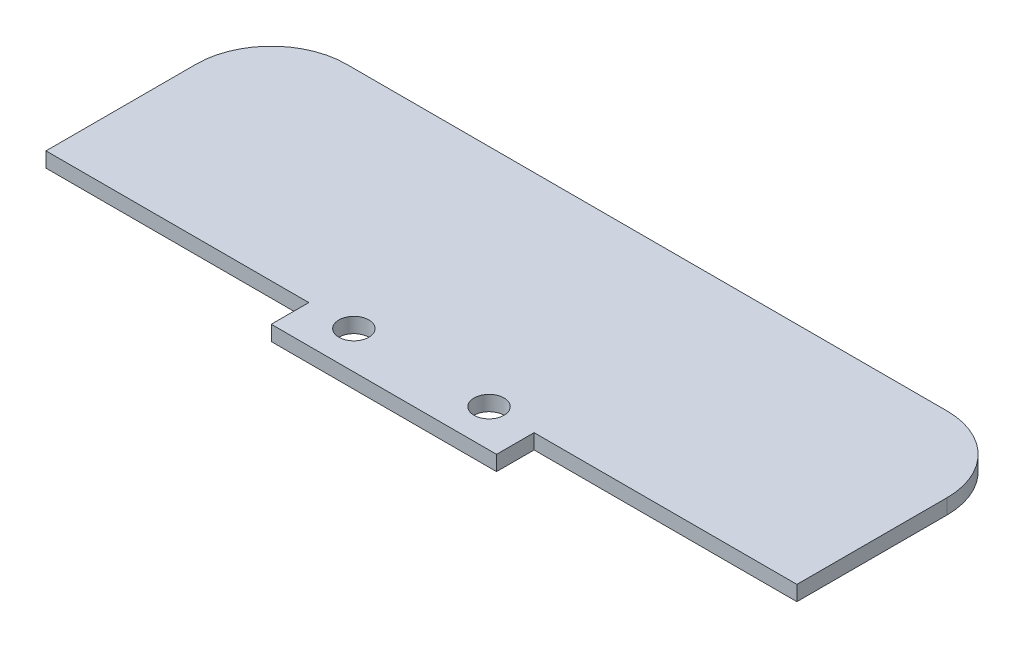
ISO-10303-21;
HEADER;
FILE_DESCRIPTION(('STEP AP214'),'2;1');
FILE_NAME('part.step','',(''),(''),'','','');
FILE_SCHEMA(('AUTOMOTIVE_DESIGN { 1 0 10303 214 1 1 1 1 }'));
ENDSEC;
DATA;
#1=APPLICATION_CONTEXT('core data for automotive mechanical design processes');
#2=APPLICATION_PROTOCOL_DEFINITION('international standard','automotive_design',2000,#1);
#3=PRODUCT_CONTEXT('',#1,'mechanical');
#4=PRODUCT('Part','Part','',(#3));
#5=PRODUCT_RELATED_PRODUCT_CATEGORY('part','',(#4));
#6=PRODUCT_DEFINITION_FORMATION('','',#4);
#7=PRODUCT_DEFINITION_CONTEXT('part definition',#1,'design');
#8=PRODUCT_DEFINITION('design','',#6,#7);
#9=PRODUCT_DEFINITION_SHAPE('','',#8);
#10=(LENGTH_UNIT() NAMED_UNIT(*) SI_UNIT(.MILLI.,.METRE.));
#11=(NAMED_UNIT(*) PLANE_ANGLE_UNIT() SI_UNIT($,.RADIAN.));
#12=(NAMED_UNIT(*) SI_UNIT($,.STERADIAN.) SOLID_ANGLE_UNIT());
#13=UNCERTAINTY_MEASURE_WITH_UNIT(LENGTH_MEASURE(1.E-05),#10,'distance_accuracy_value','');
#14=(GEOMETRIC_REPRESENTATION_CONTEXT(3) GLOBAL_UNCERTAINTY_ASSIGNED_CONTEXT((#13)) GLOBAL_UNIT_ASSIGNED_CONTEXT((#10,
#11,#12)) REPRESENTATION_CONTEXT('',''));
#15=CARTESIAN_POINT('',(0.,0.,0.));
#16=DIRECTION('',(0.,0.,1.));
#17=DIRECTION('',(1.,0.,0.));
#18=AXIS2_PLACEMENT_3D('',#15,#16,#17);
#19=CARTESIAN_POINT('',(0.,2.,0.));
#20=DIRECTION('',(0.,1.,0.));
#21=DIRECTION('',(0.,0.,1.));
#22=AXIS2_PLACEMENT_3D('',#19,#20,#21);
#23=PLANE('',#22);
#24=CARTESIAN_POINT('',(-9.,2.,15.));
#25=DIRECTION('',(0.,1.,0.));
#26=DIRECTION('',(0.,0.,1.));
#27=AXIS2_PLACEMENT_3D('',#24,#25,#26);
#28=CIRCLE('',#27,2.);
#29=CARTESIAN_POINT('',(-9.,2.,17.));
#30=VERTEX_POINT('',#29);
#31=EDGE_CURVE('E239',#30,#30,#28,.T.);
#32=ORIENTED_EDGE('',*,*,#31,.F.);
#33=EDGE_LOOP('',(#32));
#34=FACE_BOUND('',#33,.T.);
#35=DIRECTION('',(0.,0.,-1.));
#36=VECTOR('',#35,1.);
#37=CARTESIAN_POINT('',(50.,2.,-15.));
#38=LINE('',#37,#36);
#39=CARTESIAN_POINT('',(50.,2.,15.));
#40=VERTEX_POINT('',#39);
#41=CARTESIAN_POINT('',(50.,2.,-5.00000000000001));
#42=VERTEX_POINT('',#41);
#43=EDGE_CURVE('E176',#40,#42,#38,.T.);
#44=ORIENTED_EDGE('',*,*,#43,.T.);
#45=CARTESIAN_POINT('',(40.,2.,-5.00000000000001));
#46=DIRECTION('',(0.,1.,0.));
#47=DIRECTION('',(0.,0.,1.));
#48=AXIS2_PLACEMENT_3D('',#45,#46,#47);
#49=CIRCLE('',#48,10.);
#50=CARTESIAN_POINT('',(40.,2.,-15.));
#51=VERTEX_POINT('',#50);
#52=EDGE_CURVE('E52',#42,#51,#49,.T.);
#53=ORIENTED_EDGE('',*,*,#52,.T.);
#54=DIRECTION('',(-1.,0.,0.));
#55=VECTOR('',#54,1.);
#56=CARTESIAN_POINT('',(-50.,2.,-15.));
#57=LINE('',#56,#55);
#58=CARTESIAN_POINT('',(-40.,2.,-15.));
#59=VERTEX_POINT('',#58);
#60=EDGE_CURVE('E175',#51,#59,#57,.T.);
#61=ORIENTED_EDGE('',*,*,#60,.T.);
#62=CARTESIAN_POINT('',(-40.,2.,-5.));
#63=DIRECTION('',(0.,1.,0.));
#64=DIRECTION('',(0.,0.,1.));
#65=AXIS2_PLACEMENT_3D('',#62,#63,#64);
#66=CIRCLE('',#65,10.);
#67=CARTESIAN_POINT('',(-50.,2.,-4.99999999999999));
#68=VERTEX_POINT('',#67);
#69=EDGE_CURVE('E59',#59,#68,#66,.T.);
#70=ORIENTED_EDGE('',*,*,#69,.T.);
#71=DIRECTION('',(0.,0.,1.));
#72=VECTOR('',#71,1.);
#73=CARTESIAN_POINT('',(-50.,2.,-15.));
#74=LINE('',#73,#72);
#75=CARTESIAN_POINT('',(-50.,2.,15.));
#76=VERTEX_POINT('',#75);
#77=EDGE_CURVE('E139',#68,#76,#74,.T.);
#78=ORIENTED_EDGE('',*,*,#77,.T.);
#79=DIRECTION('',(1.,0.,0.));
#80=VECTOR('',#79,1.);
#81=CARTESIAN_POINT('',(-15.,2.,15.));
#82=LINE('',#81,#80);
#83=CARTESIAN_POINT('',(-15.,2.,15.));
#84=VERTEX_POINT('',#83);
#85=EDGE_CURVE('E135',#76,#84,#82,.T.);
#86=ORIENTED_EDGE('',*,*,#85,.T.);
#87=DIRECTION('',(0.,0.,1.));
#88=VECTOR('',#87,1.);
#89=CARTESIAN_POINT('',(-15.,2.,15.));
#90=LINE('',#89,#88);
#91=CARTESIAN_POINT('',(-15.,2.,20.));
#92=VERTEX_POINT('',#91);
#93=EDGE_CURVE('E124',#84,#92,#90,.T.);
#94=ORIENTED_EDGE('',*,*,#93,.T.);
#95=DIRECTION('',(1.,0.,0.));
#96=VECTOR('',#95,1.);
#97=CARTESIAN_POINT('',(-15.,2.,20.));
#98=LINE('',#97,#96);
#99=CARTESIAN_POINT('',(15.,2.,20.));
#100=VERTEX_POINT('',#99);
#101=EDGE_CURVE('E134',#92,#100,#98,.T.);
#102=ORIENTED_EDGE('',*,*,#101,.T.);
#103=DIRECTION('',(0.,0.,-1.));
#104=VECTOR('',#103,1.);
#105=CARTESIAN_POINT('',(15.,2.,20.));
#106=LINE('',#105,#104);
#107=CARTESIAN_POINT('',(15.,2.,15.));
#108=VERTEX_POINT('',#107);
#109=EDGE_CURVE('E226',#100,#108,#106,.T.);
#110=ORIENTED_EDGE('',*,*,#109,.T.);
#111=DIRECTION('',(1.,0.,0.));
#112=VECTOR('',#111,1.);
#113=CARTESIAN_POINT('',(50.,2.,15.));
#114=LINE('',#113,#112);
#115=EDGE_CURVE('E244',#108,#40,#114,.T.);
#116=ORIENTED_EDGE('',*,*,#115,.T.);
#117=EDGE_LOOP('',(#44,#53,#61,#70,#78,#86,#94,#102,#110,#116));
#118=FACE_BOUND('',#117,.T.);
#119=CARTESIAN_POINT('',(9.,2.,15.));
#120=DIRECTION('',(0.,1.,0.));
#121=DIRECTION('',(0.,0.,1.));
#122=AXIS2_PLACEMENT_3D('',#119,#120,#121);
#123=CIRCLE('',#122,2.);
#124=CARTESIAN_POINT('',(9.,2.,17.));
#125=VERTEX_POINT('',#124);
#126=EDGE_CURVE('E255',#125,#125,#123,.T.);
#127=ORIENTED_EDGE('',*,*,#126,.F.);
#128=EDGE_LOOP('',(#127));
#129=FACE_BOUND('',#128,.T.);
#130=ADVANCED_FACE('F43',(#34,#118,#129),#23,.T.);
#131=CARTESIAN_POINT('',(0.,0.,0.));
#132=DIRECTION('',(0.,1.,0.));
#133=DIRECTION('',(0.,0.,1.));
#134=AXIS2_PLACEMENT_3D('',#131,#132,#133);
#135=PLANE('',#134);
#136=DIRECTION('',(-1.,0.,0.));
#137=VECTOR('',#136,1.);
#138=CARTESIAN_POINT('',(-50.,0.,-15.));
#139=LINE('',#138,#137);
#140=CARTESIAN_POINT('',(40.,0.,-15.));
#141=VERTEX_POINT('',#140);
#142=CARTESIAN_POINT('',(-40.,0.,-15.));
#143=VERTEX_POINT('',#142);
#144=EDGE_CURVE('E193',#141,#143,#139,.T.);
#145=ORIENTED_EDGE('',*,*,#144,.F.);
#146=CARTESIAN_POINT('',(40.,0.,-5.00000000000001));
#147=DIRECTION('',(0.,1.,0.));
#148=DIRECTION('',(0.,0.,1.));
#149=AXIS2_PLACEMENT_3D('',#146,#147,#148);
#150=CIRCLE('',#149,10.);
#151=CARTESIAN_POINT('',(50.,0.,-5.00000000000001));
#152=VERTEX_POINT('',#151);
#153=EDGE_CURVE('E166',#141,#152,#150,.F.);
#154=ORIENTED_EDGE('',*,*,#153,.T.);
#155=DIRECTION('',(0.,0.,-1.));
#156=VECTOR('',#155,1.);
#157=CARTESIAN_POINT('',(50.,0.,-15.));
#158=LINE('',#157,#156);
#159=CARTESIAN_POINT('',(50.,0.,15.));
#160=VERTEX_POINT('',#159);
#161=EDGE_CURVE('E192',#160,#152,#158,.T.);
#162=ORIENTED_EDGE('',*,*,#161,.F.);
#163=DIRECTION('',(1.,0.,0.));
#164=VECTOR('',#163,1.);
#165=CARTESIAN_POINT('',(50.,0.,15.));
#166=LINE('',#165,#164);
#167=CARTESIAN_POINT('',(15.,0.,15.));
#168=VERTEX_POINT('',#167);
#169=EDGE_CURVE('E199',#168,#160,#166,.T.);
#170=ORIENTED_EDGE('',*,*,#169,.F.);
#171=DIRECTION('',(0.,0.,-1.));
#172=VECTOR('',#171,1.);
#173=CARTESIAN_POINT('',(15.,0.,20.));
#174=LINE('',#173,#172);
#175=CARTESIAN_POINT('',(15.,0.,20.));
#176=VERTEX_POINT('',#175);
#177=EDGE_CURVE('E204',#176,#168,#174,.T.);
#178=ORIENTED_EDGE('',*,*,#177,.F.);
#179=DIRECTION('',(1.,0.,0.));
#180=VECTOR('',#179,1.);
#181=CARTESIAN_POINT('',(-15.,0.,20.));
#182=LINE('',#181,#180);
#183=CARTESIAN_POINT('',(-15.,0.,20.));
#184=VERTEX_POINT('',#183);
#185=EDGE_CURVE('E229',#184,#176,#182,.T.);
#186=ORIENTED_EDGE('',*,*,#185,.F.);
#187=DIRECTION('',(0.,0.,1.));
#188=VECTOR('',#187,1.);
#189=CARTESIAN_POINT('',(-15.,0.,15.));
#190=LINE('',#189,#188);
#191=CARTESIAN_POINT('',(-15.,0.,15.));
#192=VERTEX_POINT('',#191);
#193=EDGE_CURVE('E232',#192,#184,#190,.T.);
#194=ORIENTED_EDGE('',*,*,#193,.F.);
#195=DIRECTION('',(1.,0.,0.));
#196=VECTOR('',#195,1.);
#197=CARTESIAN_POINT('',(-15.,0.,15.));
#198=LINE('',#197,#196);
#199=CARTESIAN_POINT('',(-50.,0.,15.));
#200=VERTEX_POINT('',#199);
#201=EDGE_CURVE('E148',#200,#192,#198,.T.);
#202=ORIENTED_EDGE('',*,*,#201,.F.);
#203=DIRECTION('',(0.,0.,1.));
#204=VECTOR('',#203,1.);
#205=CARTESIAN_POINT('',(-50.,0.,-15.));
#206=LINE('',#205,#204);
#207=CARTESIAN_POINT('',(-50.,0.,-4.99999999999999));
#208=VERTEX_POINT('',#207);
#209=EDGE_CURVE('E144',#208,#200,#206,.T.);
#210=ORIENTED_EDGE('',*,*,#209,.F.);
#211=CARTESIAN_POINT('',(-40.,0.,-5.));
#212=DIRECTION('',(0.,1.,0.));
#213=DIRECTION('',(0.,0.,1.));
#214=AXIS2_PLACEMENT_3D('',#211,#212,#213);
#215=CIRCLE('',#214,10.);
#216=EDGE_CURVE('E163',#208,#143,#215,.F.);
#217=ORIENTED_EDGE('',*,*,#216,.T.);
#218=EDGE_LOOP('',(#145,#154,#162,#170,#178,#186,#194,#202,#210,#217));
#219=FACE_BOUND('',#218,.T.);
#220=CARTESIAN_POINT('',(-9.,0.,15.));
#221=DIRECTION('',(0.,1.,0.));
#222=DIRECTION('',(0.,0.,1.));
#223=AXIS2_PLACEMENT_3D('',#220,#221,#222);
#224=CIRCLE('',#223,2.);
#225=CARTESIAN_POINT('',(-9.,0.,17.));
#226=VERTEX_POINT('',#225);
#227=EDGE_CURVE('E251',#226,#226,#224,.T.);
#228=ORIENTED_EDGE('',*,*,#227,.T.);
#229=EDGE_LOOP('',(#228));
#230=FACE_BOUND('',#229,.T.);
#231=CARTESIAN_POINT('',(9.,0.,15.));
#232=DIRECTION('',(0.,1.,0.));
#233=DIRECTION('',(0.,0.,1.));
#234=AXIS2_PLACEMENT_3D('',#231,#232,#233);
#235=CIRCLE('',#234,2.);
#236=CARTESIAN_POINT('',(9.,0.,17.));
#237=VERTEX_POINT('',#236);
#238=EDGE_CURVE('E259',#237,#237,#235,.T.);
#239=ORIENTED_EDGE('',*,*,#238,.T.);
#240=EDGE_LOOP('',(#239));
#241=FACE_BOUND('',#240,.T.);
#242=ADVANCED_FACE('F189',(#219,#230,#241),#135,.F.);
#243=CARTESIAN_POINT('',(-15.,2.,15.));
#244=DIRECTION('',(0.,0.,-1.));
#245=DIRECTION('',(-1.,0.,0.));
#246=AXIS2_PLACEMENT_3D('',#243,#244,#245);
#247=PLANE('',#246);
#248=ORIENTED_EDGE('',*,*,#201,.T.);
#249=DIRECTION('',(0.,-1.,0.));
#250=VECTOR('',#249,1.);
#251=CARTESIAN_POINT('',(-15.,2.,15.));
#252=LINE('',#251,#250);
#253=EDGE_CURVE('E128',#84,#192,#252,.T.);
#254=ORIENTED_EDGE('',*,*,#253,.F.);
#255=ORIENTED_EDGE('',*,*,#85,.F.);
#256=DIRECTION('',(0.,-1.,0.));
#257=VECTOR('',#256,1.);
#258=CARTESIAN_POINT('',(-50.,2.,15.));
#259=LINE('',#258,#257);
#260=EDGE_CURVE('E210',#76,#200,#259,.T.);
#261=ORIENTED_EDGE('',*,*,#260,.T.);
#262=EDGE_LOOP('',(#248,#254,#255,#261));
#263=FACE_BOUND('',#262,.T.);
#264=ADVANCED_FACE('F146',(#263),#247,.F.);
#265=CARTESIAN_POINT('',(-15.,2.,15.));
#266=DIRECTION('',(1.,0.,0.));
#267=DIRECTION('',(0.,0.,-1.));
#268=AXIS2_PLACEMENT_3D('',#265,#266,#267);
#269=PLANE('',#268);
#270=ORIENTED_EDGE('',*,*,#193,.T.);
#271=DIRECTION('',(0.,-1.,0.));
#272=VECTOR('',#271,1.);
#273=CARTESIAN_POINT('',(-15.,2.,20.));
#274=LINE('',#273,#272);
#275=EDGE_CURVE('E131',#92,#184,#274,.T.);
#276=ORIENTED_EDGE('',*,*,#275,.F.);
#277=ORIENTED_EDGE('',*,*,#93,.F.);
#278=ORIENTED_EDGE('',*,*,#253,.T.);
#279=EDGE_LOOP('',(#270,#276,#277,#278));
#280=FACE_BOUND('',#279,.T.);
#281=ADVANCED_FACE('F126',(#280),#269,.F.);
#282=CARTESIAN_POINT('',(-15.,2.,20.));
#283=DIRECTION('',(0.,0.,-1.));
#284=DIRECTION('',(-1.,0.,0.));
#285=AXIS2_PLACEMENT_3D('',#282,#283,#284);
#286=PLANE('',#285);
#287=ORIENTED_EDGE('',*,*,#185,.T.);
#288=DIRECTION('',(0.,-1.,0.));
#289=VECTOR('',#288,1.);
#290=CARTESIAN_POINT('',(15.,2.,20.));
#291=LINE('',#290,#289);
#292=EDGE_CURVE('E156',#100,#176,#291,.T.);
#293=ORIENTED_EDGE('',*,*,#292,.F.);
#294=ORIENTED_EDGE('',*,*,#101,.F.);
#295=ORIENTED_EDGE('',*,*,#275,.T.);
#296=EDGE_LOOP('',(#287,#293,#294,#295));
#297=FACE_BOUND('',#296,.T.);
#298=ADVANCED_FACE('F295',(#297),#286,.F.);
#299=CARTESIAN_POINT('',(15.,2.,20.));
#300=DIRECTION('',(-1.,0.,0.));
#301=DIRECTION('',(0.,0.,1.));
#302=AXIS2_PLACEMENT_3D('',#299,#300,#301);
#303=PLANE('',#302);
#304=ORIENTED_EDGE('',*,*,#177,.T.);
#305=DIRECTION('',(0.,-1.,0.));
#306=VECTOR('',#305,1.);
#307=CARTESIAN_POINT('',(15.,2.,15.));
#308=LINE('',#307,#306);
#309=EDGE_CURVE('E215',#108,#168,#308,.T.);
#310=ORIENTED_EDGE('',*,*,#309,.F.);
#311=ORIENTED_EDGE('',*,*,#109,.F.);
#312=ORIENTED_EDGE('',*,*,#292,.T.);
#313=EDGE_LOOP('',(#304,#310,#311,#312));
#314=FACE_BOUND('',#313,.T.);
#315=ADVANCED_FACE('F224',(#314),#303,.F.);
#316=CARTESIAN_POINT('',(50.,2.,15.));
#317=DIRECTION('',(0.,0.,-1.));
#318=DIRECTION('',(-1.,0.,0.));
#319=AXIS2_PLACEMENT_3D('',#316,#317,#318);
#320=PLANE('',#319);
#321=ORIENTED_EDGE('',*,*,#169,.T.);
#322=DIRECTION('',(0.,-1.,0.));
#323=VECTOR('',#322,1.);
#324=CARTESIAN_POINT('',(50.,2.,15.));
#325=LINE('',#324,#323);
#326=EDGE_CURVE('E197',#40,#160,#325,.T.);
#327=ORIENTED_EDGE('',*,*,#326,.F.);
#328=ORIENTED_EDGE('',*,*,#115,.F.);
#329=ORIENTED_EDGE('',*,*,#309,.T.);
#330=EDGE_LOOP('',(#321,#327,#328,#329));
#331=FACE_BOUND('',#330,.T.);
#332=ADVANCED_FACE('F289',(#331),#320,.F.);
#333=CARTESIAN_POINT('',(50.,2.,-15.));
#334=DIRECTION('',(-1.,0.,0.));
#335=DIRECTION('',(0.,0.,1.));
#336=AXIS2_PLACEMENT_3D('',#333,#334,#335);
#337=PLANE('',#336);
#338=ORIENTED_EDGE('',*,*,#161,.T.);
#339=DIRECTION('',(0.,-1.,0.));
#340=VECTOR('',#339,1.);
#341=CARTESIAN_POINT('',(50.,2.,-5.00000000000001));
#342=LINE('',#341,#340);
#343=EDGE_CURVE('E67',#152,#42,#342,.F.);
#344=ORIENTED_EDGE('',*,*,#343,.T.);
#345=ORIENTED_EDGE('',*,*,#43,.F.);
#346=ORIENTED_EDGE('',*,*,#326,.T.);
#347=EDGE_LOOP('',(#338,#344,#345,#346));
#348=FACE_BOUND('',#347,.T.);
#349=ADVANCED_FACE('F195',(#348),#337,.F.);
#350=CARTESIAN_POINT('',(-50.,2.,-15.));
#351=DIRECTION('',(0.,0.,1.));
#352=DIRECTION('',(1.,0.,0.));
#353=AXIS2_PLACEMENT_3D('',#350,#351,#352);
#354=PLANE('',#353);
#355=ORIENTED_EDGE('',*,*,#60,.F.);
#356=DIRECTION('',(0.,-1.,0.));
#357=VECTOR('',#356,1.);
#358=CARTESIAN_POINT('',(40.,2.,-15.));
#359=LINE('',#358,#357);
#360=EDGE_CURVE('E154',#51,#141,#359,.T.);
#361=ORIENTED_EDGE('',*,*,#360,.T.);
#362=ORIENTED_EDGE('',*,*,#144,.T.);
#363=DIRECTION('',(0.,-1.,0.));
#364=VECTOR('',#363,1.);
#365=CARTESIAN_POINT('',(-40.,2.,-15.));
#366=LINE('',#365,#364);
#367=EDGE_CURVE('E150',#143,#59,#366,.F.);
#368=ORIENTED_EDGE('',*,*,#367,.T.);
#369=EDGE_LOOP('',(#355,#361,#362,#368));
#370=FACE_BOUND('',#369,.T.);
#371=ADVANCED_FACE('F180',(#370),#354,.F.);
#372=CARTESIAN_POINT('',(-50.,2.,-15.));
#373=DIRECTION('',(1.,0.,0.));
#374=DIRECTION('',(0.,0.,-1.));
#375=AXIS2_PLACEMENT_3D('',#372,#373,#374);
#376=PLANE('',#375);
#377=ORIENTED_EDGE('',*,*,#77,.F.);
#378=DIRECTION('',(0.,-1.,0.));
#379=VECTOR('',#378,1.);
#380=CARTESIAN_POINT('',(-50.,2.,-4.99999999999999));
#381=LINE('',#380,#379);
#382=EDGE_CURVE('E11',#68,#208,#381,.T.);
#383=ORIENTED_EDGE('',*,*,#382,.T.);
#384=ORIENTED_EDGE('',*,*,#209,.T.);
#385=ORIENTED_EDGE('',*,*,#260,.F.);
#386=EDGE_LOOP('',(#377,#383,#384,#385));
#387=FACE_BOUND('',#386,.T.);
#388=ADVANCED_FACE('F281',(#387),#376,.F.);
#389=CARTESIAN_POINT('',(-9.,2.,15.));
#390=DIRECTION('',(0.,-1.,0.));
#391=DIRECTION('',(0.,0.,-1.));
#392=AXIS2_PLACEMENT_3D('',#389,#390,#391);
#393=CYLINDRICAL_SURFACE('',#392,2.);
#394=ORIENTED_EDGE('',*,*,#31,.T.);
#395=EDGE_LOOP('',(#394));
#396=FACE_BOUND('',#395,.T.);
#397=ORIENTED_EDGE('',*,*,#227,.F.);
#398=EDGE_LOOP('',(#397));
#399=FACE_BOUND('',#398,.T.);
#400=ADVANCED_FACE('F278',(#396,#399),#393,.F.);
#401=CARTESIAN_POINT('',(9.,2.,15.));
#402=DIRECTION('',(0.,-1.,0.));
#403=DIRECTION('',(0.,0.,-1.));
#404=AXIS2_PLACEMENT_3D('',#401,#402,#403);
#405=CYLINDRICAL_SURFACE('',#404,2.);
#406=ORIENTED_EDGE('',*,*,#126,.T.);
#407=EDGE_LOOP('',(#406));
#408=FACE_BOUND('',#407,.T.);
#409=ORIENTED_EDGE('',*,*,#238,.F.);
#410=EDGE_LOOP('',(#409));
#411=FACE_BOUND('',#410,.T.);
#412=ADVANCED_FACE('F267',(#408,#411),#405,.F.);
#413=CARTESIAN_POINT('',(40.,2.,-5.00000000000001));
#414=DIRECTION('',(0.,-1.,0.));
#415=DIRECTION('',(0.,0.,-1.));
#416=AXIS2_PLACEMENT_3D('',#413,#414,#415);
#417=CYLINDRICAL_SURFACE('',#416,10.);
#418=ORIENTED_EDGE('',*,*,#52,.F.);
#419=ORIENTED_EDGE('',*,*,#343,.F.);
#420=ORIENTED_EDGE('',*,*,#153,.F.);
#421=ORIENTED_EDGE('',*,*,#360,.F.);
#422=EDGE_LOOP('',(#418,#419,#420,#421));
#423=FACE_BOUND('',#422,.T.);
#424=ADVANCED_FACE('F186',(#423),#417,.T.);
#425=CARTESIAN_POINT('',(-40.,2.,-5.));
#426=DIRECTION('',(0.,-1.,0.));
#427=DIRECTION('',(0.,0.,-1.));
#428=AXIS2_PLACEMENT_3D('',#425,#426,#427);
#429=CYLINDRICAL_SURFACE('',#428,10.);
#430=ORIENTED_EDGE('',*,*,#69,.F.);
#431=ORIENTED_EDGE('',*,*,#367,.F.);
#432=ORIENTED_EDGE('',*,*,#216,.F.);
#433=ORIENTED_EDGE('',*,*,#382,.F.);
#434=EDGE_LOOP('',(#430,#431,#432,#433));
#435=FACE_BOUND('',#434,.T.);
#436=ADVANCED_FACE('F45',(#435),#429,.T.);
#437=CLOSED_SHELL('',(#130,#242,#264,#281,#298,#315,#332,#349,#371,#388,#400,#412,#424,#436));
#438=MANIFOLD_SOLID_BREP('B2',#437);
#439=ADVANCED_BREP_SHAPE_REPRESENTATION('',(#18,#438),#14);
#440=SHAPE_DEFINITION_REPRESENTATION(#9,#439);
ENDSEC;
END-ISO-10303-21;
